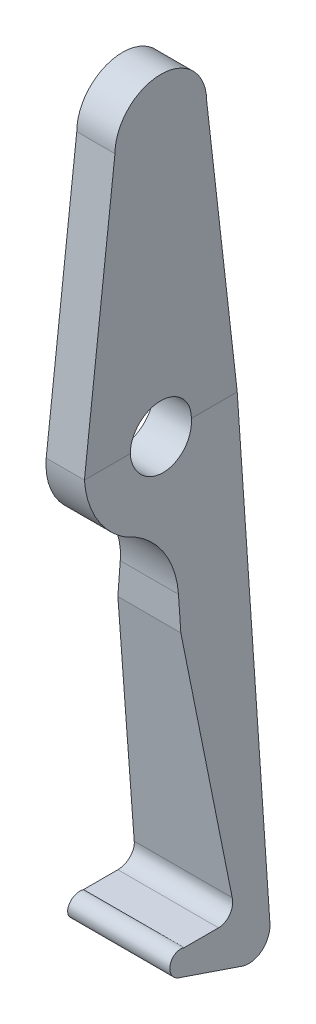
ISO-10303-21;
HEADER;
FILE_DESCRIPTION(('STEP AP214'),'2;1');
FILE_NAME('part.step','',(''),(''),'','','');
FILE_SCHEMA(('AUTOMOTIVE_DESIGN { 1 0 10303 214 1 1 1 1 }'));
ENDSEC;
DATA;
#1=APPLICATION_CONTEXT('core data for automotive mechanical design processes');
#2=APPLICATION_PROTOCOL_DEFINITION('international standard','automotive_design',2000,#1);
#3=PRODUCT_CONTEXT('',#1,'mechanical');
#4=PRODUCT('Part','Part','',(#3));
#5=PRODUCT_RELATED_PRODUCT_CATEGORY('part','',(#4));
#6=PRODUCT_DEFINITION_FORMATION('','',#4);
#7=PRODUCT_DEFINITION_CONTEXT('part definition',#1,'design');
#8=PRODUCT_DEFINITION('design','',#6,#7);
#9=PRODUCT_DEFINITION_SHAPE('','',#8);
#10=(LENGTH_UNIT() NAMED_UNIT(*) SI_UNIT(.MILLI.,.METRE.));
#11=(NAMED_UNIT(*) PLANE_ANGLE_UNIT() SI_UNIT($,.RADIAN.));
#12=(NAMED_UNIT(*) SI_UNIT($,.STERADIAN.) SOLID_ANGLE_UNIT());
#13=UNCERTAINTY_MEASURE_WITH_UNIT(LENGTH_MEASURE(1.E-05),#10,'distance_accuracy_value','');
#14=(GEOMETRIC_REPRESENTATION_CONTEXT(3) GLOBAL_UNCERTAINTY_ASSIGNED_CONTEXT((#13)) GLOBAL_UNIT_ASSIGNED_CONTEXT((#10,
#11,#12)) REPRESENTATION_CONTEXT('',''));
#15=CARTESIAN_POINT('',(0.,0.,0.));
#16=DIRECTION('',(0.,0.,1.));
#17=DIRECTION('',(1.,0.,0.));
#18=AXIS2_PLACEMENT_3D('',#15,#16,#17);
#19=CARTESIAN_POINT('',(14.,-35.,0.));
#20=DIRECTION('',(-1.,0.,0.));
#21=DIRECTION('',(0.,0.,1.));
#22=AXIS2_PLACEMENT_3D('',#19,#20,#21);
#23=CYLINDRICAL_SURFACE('',#22,4.);
#24=CARTESIAN_POINT('',(4.5,-35.,0.));
#25=DIRECTION('',(-1.,0.,0.));
#26=DIRECTION('',(0.,-1.,0.));
#27=AXIS2_PLACEMENT_3D('',#24,#25,#26);
#28=CIRCLE('',#27,4.);
#29=CARTESIAN_POINT('',(4.5,-35.,3.99999999999998));
#30=VERTEX_POINT('',#29);
#31=CARTESIAN_POINT('',(4.5,-35.,-4.00000000000002));
#32=VERTEX_POINT('',#31);
#33=EDGE_CURVE('E54',#30,#32,#28,.T.);
#34=ORIENTED_EDGE('',*,*,#33,.T.);
#35=CARTESIAN_POINT('',(4.5,-35.,0.));
#36=DIRECTION('',(-0.997295579276279,0.07349508525059,0.));
#37=DIRECTION('',(-0.0734950852505899,-0.99729557927628,0.));
#38=AXIS2_PLACEMENT_3D('',#35,#36,#37);
#39=ELLIPSE('',#38,4.0108470177946,4.);
#40=EDGE_CURVE('E172',#32,#30,#39,.T.);
#41=ORIENTED_EDGE('',*,*,#40,.T.);
#42=EDGE_LOOP('',(#34,#41));
#43=FACE_BOUND('',#42,.T.);
#44=CARTESIAN_POINT('',(9.5,-35.,0.));
#45=DIRECTION('',(1.,0.,0.));
#46=DIRECTION('',(0.,0.,-1.));
#47=AXIS2_PLACEMENT_3D('',#44,#45,#46);
#48=CIRCLE('',#47,4.);
#49=CARTESIAN_POINT('',(9.5,-35.,-4.00000000000002));
#50=VERTEX_POINT('',#49);
#51=CARTESIAN_POINT('',(9.5,-35.,3.99999999999998));
#52=VERTEX_POINT('',#51);
#53=EDGE_CURVE('E12',#50,#52,#48,.T.);
#54=ORIENTED_EDGE('',*,*,#53,.T.);
#55=CARTESIAN_POINT('',(9.5,-35.,0.));
#56=DIRECTION('',(0.997295579276279,0.07349508525059,0.));
#57=DIRECTION('',(-0.07349508525059,0.99729557927628,0.));
#58=AXIS2_PLACEMENT_3D('',#55,#56,#57);
#59=ELLIPSE('',#58,4.0108470177946,4.);
#60=EDGE_CURVE('E170',#52,#50,#59,.T.);
#61=ORIENTED_EDGE('',*,*,#60,.T.);
#62=EDGE_LOOP('',(#54,#61));
#63=FACE_BOUND('',#62,.T.);
#64=ADVANCED_FACE('F45',(#43,#63),#23,.F.);
#65=CARTESIAN_POINT('',(4.5,6.,9.99999999999999));
#66=DIRECTION('',(-1.,0.,0.));
#67=DIRECTION('',(0.,-1.,0.));
#68=AXIS2_PLACEMENT_3D('',#65,#66,#67);
#69=PLANE('',#68);
#70=DIRECTION('',(0.,-0.993532672656405,-0.113546591160732));
#71=VECTOR('',#70,1.);
#72=CARTESIAN_POINT('',(4.5,0.676873489121682,-5.92264302981468));
#73=LINE('',#72,#71);
#74=CARTESIAN_POINT('',(4.5,0.,-6.00000000000001));
#75=VERTEX_POINT('',#74);
#76=CARTESIAN_POINT('',(4.5,-35.,-10.));
#77=VERTEX_POINT('',#76);
#78=EDGE_CURVE('E161',#75,#77,#73,.T.);
#79=ORIENTED_EDGE('',*,*,#78,.T.);
#80=DIRECTION('',(0.,0.,-1.));
#81=VECTOR('',#80,1.);
#82=CARTESIAN_POINT('',(4.5,-35.,9.99999999999999));
#83=LINE('',#82,#81);
#84=EDGE_CURVE('E249',#32,#77,#83,.T.);
#85=ORIENTED_EDGE('',*,*,#84,.F.);
#86=ORIENTED_EDGE('',*,*,#33,.F.);
#87=CARTESIAN_POINT('',(4.5,-35.,9.99999999999999));
#88=VERTEX_POINT('',#87);
#89=EDGE_CURVE('E69',#88,#30,#83,.T.);
#90=ORIENTED_EDGE('',*,*,#89,.F.);
#91=DIRECTION('',(0.,0.993532672656405,-0.113546591160732));
#92=VECTOR('',#91,1.);
#93=CARTESIAN_POINT('',(4.5,0.676873489121675,5.92264302981466));
#94=LINE('',#93,#92);
#95=CARTESIAN_POINT('',(4.5,0.,5.99999999999999));
#96=VERTEX_POINT('',#95);
#97=EDGE_CURVE('E183',#88,#96,#94,.T.);
#98=ORIENTED_EDGE('',*,*,#97,.T.);
#99=CARTESIAN_POINT('',(4.5,0.,0.));
#100=DIRECTION('',(-1.,0.,0.));
#101=DIRECTION('',(0.,-1.,0.));
#102=AXIS2_PLACEMENT_3D('',#99,#100,#101);
#103=CIRCLE('',#102,6.);
#104=EDGE_CURVE('E329',#96,#75,#103,.T.);
#105=ORIENTED_EDGE('',*,*,#104,.T.);
#106=EDGE_LOOP('',(#79,#85,#86,#90,#98,#105));
#107=FACE_BOUND('',#106,.T.);
#108=ADVANCED_FACE('F247',(#107),#69,.T.);
#109=CARTESIAN_POINT('',(4.5,-35.,9.99999999999999));
#110=DIRECTION('',(-0.997295579276279,0.07349508525059,0.));
#111=DIRECTION('',(-0.0734950852505899,-0.99729557927628,0.));
#112=AXIS2_PLACEMENT_3D('',#109,#110,#111);
#113=PLANE('',#112);
#114=CARTESIAN_POINT('',(4.5,-35.,0.));
#115=DIRECTION('',(-0.997295579276279,0.07349508525059,0.));
#116=DIRECTION('',(-0.0734950852505899,-0.99729557927628,0.));
#117=AXIS2_PLACEMENT_3D('',#114,#115,#116);
#118=ELLIPSE('',#117,10.0271175444865,10.);
#119=CARTESIAN_POINT('',(3.87253540855654,-43.5144150940887,5.24449574368739));
#120=VERTEX_POINT('',#119);
#121=EDGE_CURVE('E252',#120,#88,#118,.T.);
#122=ORIENTED_EDGE('',*,*,#121,.T.);
#123=ORIENTED_EDGE('',*,*,#89,.T.);
#124=ORIENTED_EDGE('',*,*,#40,.F.);
#125=ORIENTED_EDGE('',*,*,#84,.T.);
#126=DIRECTION('',(0.0734950852505899,0.99729557927628,0.));
#127=VECTOR('',#126,1.);
#128=CARTESIAN_POINT('',(4.5,-35.,-10.));
#129=LINE('',#128,#127);
#130=CARTESIAN_POINT('',(0.221083157624917,-93.0629961369728,-10.));
#131=VERTEX_POINT('',#130);
#132=EDGE_CURVE('E367',#131,#77,#129,.T.);
#133=ORIENTED_EDGE('',*,*,#132,.F.);
#134=CARTESIAN_POINT('',(0.221083157624917,-93.0629961369727,-7.00000000000001));
#135=DIRECTION('',(-0.997295579276279,0.07349508525059,0.));
#136=DIRECTION('',(-0.0734950852505899,-0.99729557927628,0.));
#137=AXIS2_PLACEMENT_3D('',#134,#135,#136);
#138=ELLIPSE('',#137,3.00813526334595,3.);
#139=CARTESIAN_POINT('',(0.00464246162669782,-96.0000000000001,-6.38843781300463));
#140=VERTEX_POINT('',#139);
#141=EDGE_CURVE('E263',#140,#131,#138,.F.);
#142=ORIENTED_EDGE('',*,*,#141,.F.);
#143=DIRECTION('',(-0.0227669149156254,-0.308936897231916,-0.950810002636669));
#144=VECTOR('',#143,1.);
#145=CARTESIAN_POINT('',(0.825407134214152,-84.8625888818731,27.8889890320073));
#146=LINE('',#145,#144);
#147=CARTESIAN_POINT('',(0.204628197374332,-93.2862826201317,1.96352549156241));
#148=VERTEX_POINT('',#147);
#149=EDGE_CURVE('E266',#148,#140,#146,.T.);
#150=ORIENTED_EDGE('',*,*,#149,.F.);
#151=CARTESIAN_POINT('',(0.309759486225473,-91.859697845689,1.49999999999999));
#152=DIRECTION('',(-0.997295579276279,0.07349508525059,0.));
#153=DIRECTION('',(-0.0734950852505899,-0.99729557927628,0.));
#154=AXIS2_PLACEMENT_3D('',#151,#152,#153);
#155=ELLIPSE('',#154,1.50406763167297,1.5);
#156=CARTESIAN_POINT('',(0.414890775076613,-90.4331130712463,1.03647450843757));
#157=VERTEX_POINT('',#156);
#158=EDGE_CURVE('E270',#157,#148,#155,.F.);
#159=ORIENTED_EDGE('',*,*,#158,.F.);
#160=DIRECTION('',(0.,0.,1.));
#161=VECTOR('',#160,1.);
#162=CARTESIAN_POINT('',(0.414890775076613,-90.4331130712463,0.));
#163=LINE('',#162,#161);
#164=CARTESIAN_POINT('',(0.414890775076613,-90.4331130712463,-3.46352549156244));
#165=VERTEX_POINT('',#164);
#166=EDGE_CURVE('E274',#165,#157,#163,.T.);
#167=ORIENTED_EDGE('',*,*,#166,.F.);
#168=CARTESIAN_POINT('',(0.562279546826559,-88.4331130712463,-3.46352549156244));
#169=DIRECTION('',(-0.997295579276279,0.07349508525059,0.));
#170=DIRECTION('',(-0.0734950852505899,-0.99729557927628,0.));
#171=AXIS2_PLACEMENT_3D('',#168,#169,#170);
#172=ELLIPSE('',#171,2.0054235088973,2.);
#173=CARTESIAN_POINT('',(0.587886776459358,-88.0856343681027,-5.4331088360446));
#174=VERTEX_POINT('',#173);
#175=EDGE_CURVE('E278',#174,#165,#172,.T.);
#176=ORIENTED_EDGE('',*,*,#175,.F.);
#177=DIRECTION('',(-0.0727628592374531,-0.987359598340377,-0.140806924122081));
#178=VECTOR('',#177,1.);
#179=CARTESIAN_POINT('',(7.04290701184345,-0.493884213138229,7.05831266684186));
#180=LINE('',#179,#178);
#181=CARTESIAN_POINT('',(2.87872351075061,-57.,-1.00000000000001));
#182=VERTEX_POINT('',#181);
#183=EDGE_CURVE('E282',#182,#174,#180,.T.);
#184=ORIENTED_EDGE('',*,*,#183,.F.);
#185=DIRECTION('',(-0.0734950852505899,-0.99729557927628,0.));
#186=VECTOR('',#185,1.);
#187=CARTESIAN_POINT('',(7.11668583844505,0.507261609920297,-0.999999999999987));
#188=LINE('',#187,#186);
#189=CARTESIAN_POINT('',(3.18953439396952,-52.7824347197055,-1.00000000000001));
#190=VERTEX_POINT('',#189);
#191=EDGE_CURVE('E286',#190,#182,#188,.T.);
#192=ORIENTED_EDGE('',*,*,#191,.F.);
#193=CARTESIAN_POINT('',(3.18953439396952,-52.7824347197055,9.));
#194=DIRECTION('',(-0.997295579276279,0.07349508525059,0.));
#195=DIRECTION('',(-0.0734950852505899,-0.99729557927628,0.));
#196=AXIS2_PLACEMENT_3D('',#193,#194,#195);
#197=ELLIPSE('',#196,10.0271175444865,10.);
#198=EDGE_CURVE('E290',#120,#190,#197,.T.);
#199=ORIENTED_EDGE('',*,*,#198,.F.);
#200=EDGE_LOOP('',(#122,#123,#124,#125,#133,#142,#150,#159,#167,#176,#184,#192,#199));
#201=FACE_BOUND('',#200,.T.);
#202=ADVANCED_FACE('F251',(#201),#113,.T.);
#203=CARTESIAN_POINT('',(9.5,-35.,9.99999999999999));
#204=DIRECTION('',(1.,0.,0.));
#205=DIRECTION('',(0.,0.,-1.));
#206=AXIS2_PLACEMENT_3D('',#203,#204,#205);
#207=PLANE('',#206);
#208=DIRECTION('',(0.,0.993532672656405,0.113546591160732));
#209=VECTOR('',#208,1.);
#210=CARTESIAN_POINT('',(9.5,0.676873489121682,-5.92264302981468));
#211=LINE('',#210,#209);
#212=CARTESIAN_POINT('',(9.5,-35.,-10.));
#213=VERTEX_POINT('',#212);
#214=CARTESIAN_POINT('',(9.5,0.,-6.00000000000001));
#215=VERTEX_POINT('',#214);
#216=EDGE_CURVE('E190',#213,#215,#211,.T.);
#217=ORIENTED_EDGE('',*,*,#216,.T.);
#218=CARTESIAN_POINT('',(9.5,0.,0.));
#219=DIRECTION('',(1.,0.,0.));
#220=DIRECTION('',(0.,0.,-1.));
#221=AXIS2_PLACEMENT_3D('',#218,#219,#220);
#222=CIRCLE('',#221,6.);
#223=CARTESIAN_POINT('',(9.5,0.,5.99999999999999));
#224=VERTEX_POINT('',#223);
#225=EDGE_CURVE('E61',#215,#224,#222,.T.);
#226=ORIENTED_EDGE('',*,*,#225,.T.);
#227=DIRECTION('',(0.,-0.993532672656405,0.113546591160732));
#228=VECTOR('',#227,1.);
#229=CARTESIAN_POINT('',(9.5,0.676873489121675,5.92264302981466));
#230=LINE('',#229,#228);
#231=CARTESIAN_POINT('',(9.5,-35.,9.99999999999999));
#232=VERTEX_POINT('',#231);
#233=EDGE_CURVE('E151',#224,#232,#230,.T.);
#234=ORIENTED_EDGE('',*,*,#233,.T.);
#235=DIRECTION('',(0.,0.,-1.));
#236=VECTOR('',#235,1.);
#237=CARTESIAN_POINT('',(9.5,-35.,9.99999999999999));
#238=LINE('',#237,#236);
#239=EDGE_CURVE('E154',#232,#52,#238,.T.);
#240=ORIENTED_EDGE('',*,*,#239,.T.);
#241=ORIENTED_EDGE('',*,*,#53,.F.);
#242=EDGE_CURVE('E173',#50,#213,#238,.T.);
#243=ORIENTED_EDGE('',*,*,#242,.T.);
#244=EDGE_LOOP('',(#217,#226,#234,#240,#241,#243));
#245=FACE_BOUND('',#244,.T.);
#246=ADVANCED_FACE('F153',(#245),#207,.T.);
#247=CARTESIAN_POINT('',(14.,-96.0629961369727,9.99999999999999));
#248=DIRECTION('',(0.997295579276279,0.07349508525059,0.));
#249=DIRECTION('',(-0.07349508525059,0.99729557927628,0.));
#250=AXIS2_PLACEMENT_3D('',#247,#248,#249);
#251=PLANE('',#250);
#252=CARTESIAN_POINT('',(9.5,-35.,0.));
#253=DIRECTION('',(0.997295579276279,0.07349508525059,0.));
#254=DIRECTION('',(-0.07349508525059,0.99729557927628,0.));
#255=AXIS2_PLACEMENT_3D('',#252,#253,#254);
#256=ELLIPSE('',#255,10.0271175444865,10.);
#257=CARTESIAN_POINT('',(10.1274645914435,-43.5144150940887,5.24449574368739));
#258=VERTEX_POINT('',#257);
#259=EDGE_CURVE('E166',#232,#258,#256,.T.);
#260=ORIENTED_EDGE('',*,*,#259,.T.);
#261=CARTESIAN_POINT('',(10.8104656060305,-52.7824347197055,9.));
#262=DIRECTION('',(0.997295579276279,0.07349508525059,0.));
#263=DIRECTION('',(-0.07349508525059,0.99729557927628,0.));
#264=AXIS2_PLACEMENT_3D('',#261,#262,#263);
#265=ELLIPSE('',#264,10.0271175444865,10.);
#266=CARTESIAN_POINT('',(10.8104656060305,-52.7824347197055,-1.00000000000001));
#267=VERTEX_POINT('',#266);
#268=EDGE_CURVE('E184',#267,#258,#265,.T.);
#269=ORIENTED_EDGE('',*,*,#268,.F.);
#270=DIRECTION('',(-0.07349508525059,0.99729557927628,0.));
#271=VECTOR('',#270,1.);
#272=CARTESIAN_POINT('',(6.95893554733883,-0.518886920744956,-0.999999999999987));
#273=LINE('',#272,#271);
#274=CARTESIAN_POINT('',(11.1212764892494,-57.,-1.00000000000001));
#275=VERTEX_POINT('',#274);
#276=EDGE_CURVE('E321',#275,#267,#273,.T.);
#277=ORIENTED_EDGE('',*,*,#276,.F.);
#278=DIRECTION('',(-0.0727628592374532,0.987359598340377,0.140806924122081));
#279=VECTOR('',#278,1.);
#280=CARTESIAN_POINT('',(7.03121505973827,-1.49968771772929,6.91487546524811));
#281=LINE('',#280,#279);
#282=CARTESIAN_POINT('',(13.4121132235406,-88.0856343681027,-5.4331088360446));
#283=VERTEX_POINT('',#282);
#284=EDGE_CURVE('E317',#283,#275,#281,.T.);
#285=ORIENTED_EDGE('',*,*,#284,.F.);
#286=CARTESIAN_POINT('',(13.4377204531734,-88.4331130712463,-3.46352549156244));
#287=DIRECTION('',(0.997295579276279,0.07349508525059,0.));
#288=DIRECTION('',(-0.07349508525059,0.99729557927628,0.));
#289=AXIS2_PLACEMENT_3D('',#286,#287,#288);
#290=ELLIPSE('',#289,2.0054235088973,2.);
#291=CARTESIAN_POINT('',(13.5851092249234,-90.4331130712463,-3.46352549156244));
#292=VERTEX_POINT('',#291);
#293=EDGE_CURVE('E313',#292,#283,#290,.T.);
#294=ORIENTED_EDGE('',*,*,#293,.F.);
#295=DIRECTION('',(0.,0.,-1.));
#296=VECTOR('',#295,1.);
#297=CARTESIAN_POINT('',(13.5851092249234,-90.4331130712463,0.));
#298=LINE('',#297,#296);
#299=CARTESIAN_POINT('',(13.5851092249234,-90.4331130712463,1.03647450843757));
#300=VERTEX_POINT('',#299);
#301=EDGE_CURVE('E309',#300,#292,#298,.T.);
#302=ORIENTED_EDGE('',*,*,#301,.F.);
#303=CARTESIAN_POINT('',(13.6902405137745,-91.859697845689,1.49999999999997));
#304=DIRECTION('',(0.997295579276279,0.07349508525059,0.));
#305=DIRECTION('',(-0.07349508525059,0.99729557927628,0.));
#306=AXIS2_PLACEMENT_3D('',#303,#304,#305);
#307=ELLIPSE('',#306,1.50406763167297,1.5);
#308=CARTESIAN_POINT('',(13.7953718026257,-93.2862826201317,1.96352549156241));
#309=VERTEX_POINT('',#308);
#310=EDGE_CURVE('E305',#309,#300,#307,.F.);
#311=ORIENTED_EDGE('',*,*,#310,.F.);
#312=DIRECTION('',(-0.0227669149156254,0.308936897231916,0.950810002636669));
#313=VECTOR('',#312,1.);
#314=CARTESIAN_POINT('',(13.1818495195927,-84.9610584426232,27.5859308859739));
#315=LINE('',#314,#313);
#316=CARTESIAN_POINT('',(13.9953575383733,-96.0000000000001,-6.38843781300463));
#317=VERTEX_POINT('',#316);
#318=EDGE_CURVE('E301',#317,#309,#315,.T.);
#319=ORIENTED_EDGE('',*,*,#318,.F.);
#320=CARTESIAN_POINT('',(13.7789168423751,-93.0629961369727,-7.00000000000001));
#321=DIRECTION('',(0.997295579276279,0.07349508525059,0.));
#322=DIRECTION('',(-0.07349508525059,0.99729557927628,0.));
#323=AXIS2_PLACEMENT_3D('',#320,#321,#322);
#324=ELLIPSE('',#323,3.00813526334595,3.);
#325=CARTESIAN_POINT('',(13.7789168423751,-93.0629961369727,-10.));
#326=VERTEX_POINT('',#325);
#327=EDGE_CURVE('E298',#326,#317,#324,.F.);
#328=ORIENTED_EDGE('',*,*,#327,.F.);
#329=DIRECTION('',(0.07349508525059,-0.99729557927628,0.));
#330=VECTOR('',#329,1.);
#331=CARTESIAN_POINT('',(14.,-96.0629961369728,-10.));
#332=LINE('',#331,#330);
#333=EDGE_CURVE('E258',#213,#326,#332,.T.);
#334=ORIENTED_EDGE('',*,*,#333,.F.);
#335=ORIENTED_EDGE('',*,*,#242,.F.);
#336=ORIENTED_EDGE('',*,*,#60,.F.);
#337=ORIENTED_EDGE('',*,*,#239,.F.);
#338=EDGE_LOOP('',(#260,#269,#277,#285,#294,#302,#311,#319,#328,#334,#335,#336,#337));
#339=FACE_BOUND('',#338,.T.);
#340=ADVANCED_FACE('F165',(#339),#251,.T.);
#341=CARTESIAN_POINT('',(14.,-35.,0.));
#342=DIRECTION('',(-1.,0.,0.));
#343=DIRECTION('',(0.,0.,1.));
#344=AXIS2_PLACEMENT_3D('',#341,#342,#343);
#345=CYLINDRICAL_SURFACE('',#344,10.);
#346=ORIENTED_EDGE('',*,*,#121,.F.);
#347=DIRECTION('',(-1.,0.,0.));
#348=VECTOR('',#347,1.);
#349=CARTESIAN_POINT('',(14.,-43.5144150940887,5.24449574368739));
#350=LINE('',#349,#348);
#351=EDGE_CURVE('E181',#258,#120,#350,.T.);
#352=ORIENTED_EDGE('',*,*,#351,.F.);
#353=ORIENTED_EDGE('',*,*,#259,.F.);
#354=DIRECTION('',(-1.,0.,0.));
#355=VECTOR('',#354,1.);
#356=CARTESIAN_POINT('',(14.,-35.,9.99999999999999));
#357=LINE('',#356,#355);
#358=EDGE_CURVE('E179',#232,#88,#357,.T.);
#359=ORIENTED_EDGE('',*,*,#358,.T.);
#360=EDGE_LOOP('',(#346,#352,#353,#359));
#361=FACE_BOUND('',#360,.T.);
#362=ADVANCED_FACE('F47',(#361),#345,.T.);
#363=CARTESIAN_POINT('',(14.,-52.7824347197055,9.));
#364=DIRECTION('',(-1.,0.,0.));
#365=DIRECTION('',(0.,0.,1.));
#366=AXIS2_PLACEMENT_3D('',#363,#364,#365);
#367=CYLINDRICAL_SURFACE('',#366,10.);
#368=ORIENTED_EDGE('',*,*,#351,.T.);
#369=ORIENTED_EDGE('',*,*,#198,.T.);
#370=DIRECTION('',(-1.,0.,0.));
#371=VECTOR('',#370,1.);
#372=CARTESIAN_POINT('',(14.,-52.7824347197055,-1.00000000000001));
#373=LINE('',#372,#371);
#374=EDGE_CURVE('E235',#267,#190,#373,.T.);
#375=ORIENTED_EDGE('',*,*,#374,.F.);
#376=ORIENTED_EDGE('',*,*,#268,.T.);
#377=EDGE_LOOP('',(#368,#369,#375,#376));
#378=FACE_BOUND('',#377,.T.);
#379=ADVANCED_FACE('F403',(#378),#367,.F.);
#380=CARTESIAN_POINT('',(14.,0.,-1.));
#381=DIRECTION('',(0.,0.,1.));
#382=DIRECTION('',(0.,-1.,0.));
#383=AXIS2_PLACEMENT_3D('',#380,#381,#382);
#384=PLANE('',#383);
#385=ORIENTED_EDGE('',*,*,#374,.T.);
#386=ORIENTED_EDGE('',*,*,#191,.T.);
#387=DIRECTION('',(-1.,0.,0.));
#388=VECTOR('',#387,1.);
#389=CARTESIAN_POINT('',(14.,-57.,-1.00000000000001));
#390=LINE('',#389,#388);
#391=EDGE_CURVE('E231',#275,#182,#390,.T.);
#392=ORIENTED_EDGE('',*,*,#391,.F.);
#393=ORIENTED_EDGE('',*,*,#276,.T.);
#394=EDGE_LOOP('',(#385,#386,#392,#393));
#395=FACE_BOUND('',#394,.T.);
#396=ADVANCED_FACE('F407',(#395),#384,.T.);
#397=CARTESIAN_POINT('',(14.,-0.996363736886906,6.98665427987494));
#398=DIRECTION('',(0.,-0.141181157254869,0.989983778067185));
#399=DIRECTION('',(0.,-0.989983778067185,-0.141181157254869));
#400=AXIS2_PLACEMENT_3D('',#397,#398,#399);
#401=PLANE('',#400);
#402=ORIENTED_EDGE('',*,*,#391,.T.);
#403=ORIENTED_EDGE('',*,*,#183,.T.);
#404=DIRECTION('',(-1.,0.,0.));
#405=VECTOR('',#404,1.);
#406=CARTESIAN_POINT('',(14.,-88.0856343681027,-5.43310883604461));
#407=LINE('',#406,#405);
#408=EDGE_CURVE('E227',#283,#174,#407,.T.);
#409=ORIENTED_EDGE('',*,*,#408,.F.);
#410=ORIENTED_EDGE('',*,*,#284,.T.);
#411=EDGE_LOOP('',(#402,#403,#409,#410));
#412=FACE_BOUND('',#411,.T.);
#413=ADVANCED_FACE('F412',(#412),#401,.T.);
#414=CARTESIAN_POINT('',(14.,-88.4331130712463,-3.46352549156244));
#415=DIRECTION('',(-1.,0.,0.));
#416=DIRECTION('',(0.,0.,1.));
#417=AXIS2_PLACEMENT_3D('',#414,#415,#416);
#418=CYLINDRICAL_SURFACE('',#417,2.);
#419=ORIENTED_EDGE('',*,*,#408,.T.);
#420=ORIENTED_EDGE('',*,*,#175,.T.);
#421=DIRECTION('',(-1.,0.,0.));
#422=VECTOR('',#421,1.);
#423=CARTESIAN_POINT('',(14.,-90.4331130712463,-3.46352549156244));
#424=LINE('',#423,#422);
#425=EDGE_CURVE('E223',#292,#165,#424,.T.);
#426=ORIENTED_EDGE('',*,*,#425,.F.);
#427=ORIENTED_EDGE('',*,*,#293,.T.);
#428=EDGE_LOOP('',(#419,#420,#426,#427));
#429=FACE_BOUND('',#428,.T.);
#430=ADVANCED_FACE('F418',(#429),#418,.F.);
#431=CARTESIAN_POINT('',(14.,-90.4331130712463,0.));
#432=DIRECTION('',(0.,1.,0.));
#433=DIRECTION('',(0.,0.,1.));
#434=AXIS2_PLACEMENT_3D('',#431,#432,#433);
#435=PLANE('',#434);
#436=ORIENTED_EDGE('',*,*,#425,.T.);
#437=ORIENTED_EDGE('',*,*,#166,.T.);
#438=DIRECTION('',(-1.,0.,0.));
#439=VECTOR('',#438,1.);
#440=CARTESIAN_POINT('',(14.,-90.4331130712463,1.03647450843757));
#441=LINE('',#440,#439);
#442=EDGE_CURVE('E219',#300,#157,#441,.T.);
#443=ORIENTED_EDGE('',*,*,#442,.F.);
#444=ORIENTED_EDGE('',*,*,#301,.T.);
#445=EDGE_LOOP('',(#436,#437,#443,#444));
#446=FACE_BOUND('',#445,.T.);
#447=ADVANCED_FACE('F422',(#446),#435,.T.);
#448=CARTESIAN_POINT('',(14.,-91.859697845689,1.49999999999997));
#449=DIRECTION('',(-1.,0.,0.));
#450=DIRECTION('',(0.,0.,1.));
#451=AXIS2_PLACEMENT_3D('',#448,#449,#450);
#452=CYLINDRICAL_SURFACE('',#451,1.5);
#453=ORIENTED_EDGE('',*,*,#442,.T.);
#454=ORIENTED_EDGE('',*,*,#158,.T.);
#455=DIRECTION('',(-1.,0.,0.));
#456=VECTOR('',#455,1.);
#457=CARTESIAN_POINT('',(14.,-93.2862826201317,1.96352549156241));
#458=LINE('',#457,#456);
#459=EDGE_CURVE('E215',#309,#148,#458,.T.);
#460=ORIENTED_EDGE('',*,*,#459,.F.);
#461=ORIENTED_EDGE('',*,*,#310,.T.);
#462=EDGE_LOOP('',(#453,#454,#460,#461));
#463=FACE_BOUND('',#462,.T.);
#464=ADVANCED_FACE('F426',(#463),#452,.T.);
#465=CARTESIAN_POINT('',(14.,-84.9553009641616,27.6036505826506));
#466=DIRECTION('',(0.,-0.951056516295154,0.309016994374948));
#467=DIRECTION('',(0.,-0.309016994374948,-0.951056516295154));
#468=AXIS2_PLACEMENT_3D('',#465,#466,#467);
#469=PLANE('',#468);
#470=ORIENTED_EDGE('',*,*,#459,.T.);
#471=ORIENTED_EDGE('',*,*,#149,.T.);
#472=DIRECTION('',(-1.,0.,0.));
#473=VECTOR('',#472,1.);
#474=CARTESIAN_POINT('',(14.,-96.0000000000001,-6.38843781300463));
#475=LINE('',#474,#473);
#476=EDGE_CURVE('E211',#317,#140,#475,.T.);
#477=ORIENTED_EDGE('',*,*,#476,.F.);
#478=ORIENTED_EDGE('',*,*,#318,.T.);
#479=EDGE_LOOP('',(#470,#471,#477,#478));
#480=FACE_BOUND('',#479,.T.);
#481=ADVANCED_FACE('F430',(#480),#469,.T.);
#482=CARTESIAN_POINT('',(14.,-93.0629961369727,-7.00000000000001));
#483=DIRECTION('',(-1.,0.,0.));
#484=DIRECTION('',(0.,0.,1.));
#485=AXIS2_PLACEMENT_3D('',#482,#483,#484);
#486=CYLINDRICAL_SURFACE('',#485,3.);
#487=ORIENTED_EDGE('',*,*,#476,.T.);
#488=ORIENTED_EDGE('',*,*,#141,.T.);
#489=DIRECTION('',(-1.,0.,0.));
#490=VECTOR('',#489,1.);
#491=CARTESIAN_POINT('',(14.,-93.0629961369727,-10.));
#492=LINE('',#491,#490);
#493=EDGE_CURVE('E207',#326,#131,#492,.T.);
#494=ORIENTED_EDGE('',*,*,#493,.F.);
#495=ORIENTED_EDGE('',*,*,#327,.T.);
#496=EDGE_LOOP('',(#487,#488,#494,#495));
#497=FACE_BOUND('',#496,.T.);
#498=ADVANCED_FACE('F434',(#497),#486,.T.);
#499=CARTESIAN_POINT('',(14.,0.,-10.));
#500=DIRECTION('',(0.,0.,-1.));
#501=DIRECTION('',(-1.,0.,0.));
#502=AXIS2_PLACEMENT_3D('',#499,#500,#501);
#503=PLANE('',#502);
#504=ORIENTED_EDGE('',*,*,#493,.T.);
#505=ORIENTED_EDGE('',*,*,#132,.T.);
#506=DIRECTION('',(-1.,0.,0.));
#507=VECTOR('',#506,1.);
#508=CARTESIAN_POINT('',(14.,-35.,-10.));
#509=LINE('',#508,#507);
#510=EDGE_CURVE('E203',#213,#77,#509,.T.);
#511=ORIENTED_EDGE('',*,*,#510,.F.);
#512=ORIENTED_EDGE('',*,*,#333,.T.);
#513=EDGE_LOOP('',(#504,#505,#511,#512));
#514=FACE_BOUND('',#513,.T.);
#515=ADVANCED_FACE('F370',(#514),#503,.T.);
#516=CARTESIAN_POINT('',(14.,0.676873489121682,-5.92264302981468));
#517=DIRECTION('',(0.,-0.113546591160732,0.993532672656405));
#518=DIRECTION('',(0.,-0.993532672656405,-0.113546591160732));
#519=AXIS2_PLACEMENT_3D('',#516,#517,#518);
#520=PLANE('',#519);
#521=ORIENTED_EDGE('',*,*,#216,.F.);
#522=ORIENTED_EDGE('',*,*,#510,.T.);
#523=ORIENTED_EDGE('',*,*,#78,.F.);
#524=DIRECTION('',(-1.,0.,0.));
#525=VECTOR('',#524,1.);
#526=CARTESIAN_POINT('',(14.,0.,-6.00000000000001));
#527=LINE('',#526,#525);
#528=EDGE_CURVE('E195',#215,#75,#527,.T.);
#529=ORIENTED_EDGE('',*,*,#528,.F.);
#530=EDGE_LOOP('',(#521,#522,#523,#529));
#531=FACE_BOUND('',#530,.T.);
#532=ADVANCED_FACE('F376',(#531),#520,.F.);
#533=CARTESIAN_POINT('',(14.,0.,0.));
#534=DIRECTION('',(-1.,0.,0.));
#535=DIRECTION('',(0.,0.,1.));
#536=AXIS2_PLACEMENT_3D('',#533,#534,#535);
#537=CYLINDRICAL_SURFACE('',#536,6.);
#538=ORIENTED_EDGE('',*,*,#225,.F.);
#539=ORIENTED_EDGE('',*,*,#528,.T.);
#540=ORIENTED_EDGE('',*,*,#104,.F.);
#541=DIRECTION('',(-1.,0.,0.));
#542=VECTOR('',#541,1.);
#543=CARTESIAN_POINT('',(14.,0.,5.99999999999999));
#544=LINE('',#543,#542);
#545=EDGE_CURVE('E189',#224,#96,#544,.T.);
#546=ORIENTED_EDGE('',*,*,#545,.F.);
#547=EDGE_LOOP('',(#538,#539,#540,#546));
#548=FACE_BOUND('',#547,.T.);
#549=ADVANCED_FACE('F379',(#548),#537,.T.);
#550=CARTESIAN_POINT('',(14.,0.676873489121675,5.92264302981466));
#551=DIRECTION('',(0.,-0.113546591160732,-0.993532672656405));
#552=DIRECTION('',(0.,0.993532672656405,-0.113546591160732));
#553=AXIS2_PLACEMENT_3D('',#550,#551,#552);
#554=PLANE('',#553);
#555=ORIENTED_EDGE('',*,*,#233,.F.);
#556=ORIENTED_EDGE('',*,*,#545,.T.);
#557=ORIENTED_EDGE('',*,*,#97,.F.);
#558=ORIENTED_EDGE('',*,*,#358,.F.);
#559=EDGE_LOOP('',(#555,#556,#557,#558));
#560=FACE_BOUND('',#559,.T.);
#561=ADVANCED_FACE('F187',(#560),#554,.F.);
#562=CLOSED_SHELL('',(#64,#108,#202,#246,#340,#362,#379,#396,#413,#430,#447,#464,#481,#498,#515,
#532,#549,#561));
#563=MANIFOLD_SOLID_BREP('B2',#562);
#564=ADVANCED_BREP_SHAPE_REPRESENTATION('',(#18,#563),#14);
#565=SHAPE_DEFINITION_REPRESENTATION(#9,#564);
ENDSEC;
END-ISO-10303-21;
